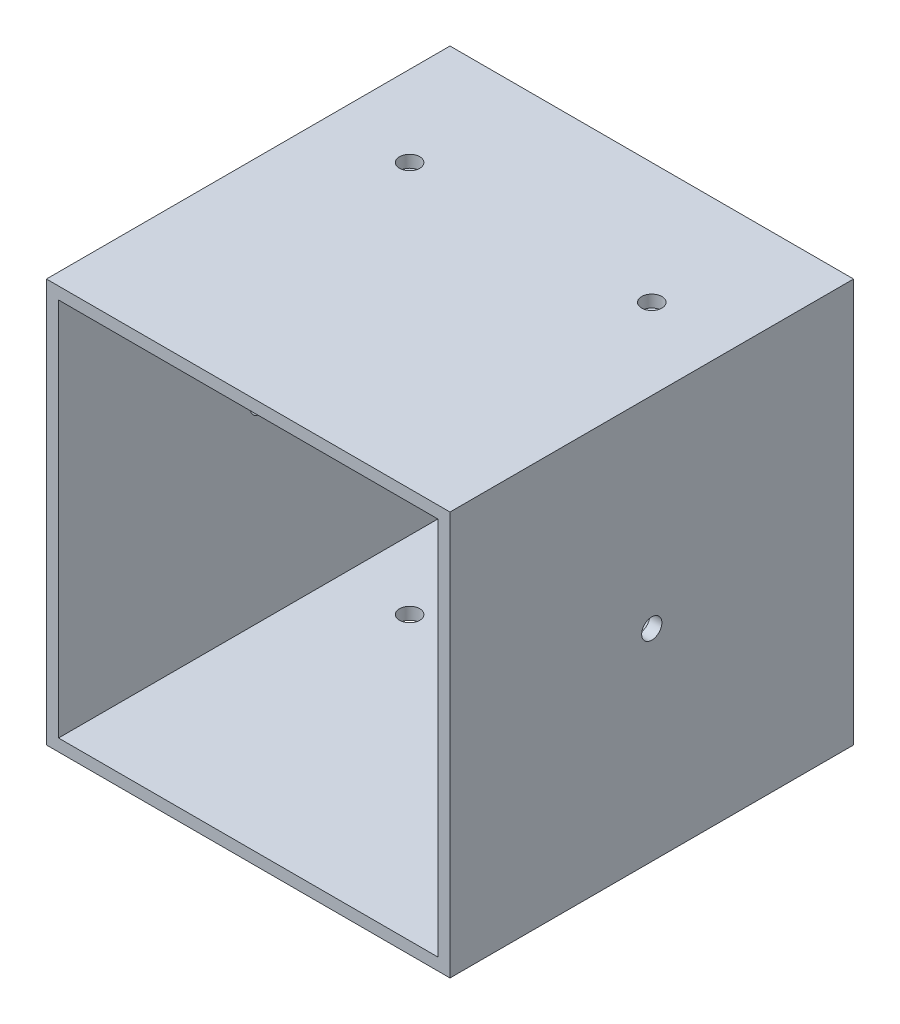
ISO-10303-21;
HEADER;
FILE_DESCRIPTION(('STEP AP214'),'2;1');
FILE_NAME('part.step','',(''),(''),'','','');
FILE_SCHEMA(('AUTOMOTIVE_DESIGN { 1 0 10303 214 1 1 1 1 }'));
ENDSEC;
DATA;
#1=APPLICATION_CONTEXT('core data for automotive mechanical design processes');
#2=APPLICATION_PROTOCOL_DEFINITION('international standard','automotive_design',2000,#1);
#3=PRODUCT_CONTEXT('',#1,'mechanical');
#4=PRODUCT('Part','Part','',(#3));
#5=PRODUCT_RELATED_PRODUCT_CATEGORY('part','',(#4));
#6=PRODUCT_DEFINITION_FORMATION('','',#4);
#7=PRODUCT_DEFINITION_CONTEXT('part definition',#1,'design');
#8=PRODUCT_DEFINITION('design','',#6,#7);
#9=PRODUCT_DEFINITION_SHAPE('','',#8);
#10=(LENGTH_UNIT() NAMED_UNIT(*) SI_UNIT(.MILLI.,.METRE.));
#11=(NAMED_UNIT(*) PLANE_ANGLE_UNIT() SI_UNIT($,.RADIAN.));
#12=(NAMED_UNIT(*) SI_UNIT($,.STERADIAN.) SOLID_ANGLE_UNIT());
#13=UNCERTAINTY_MEASURE_WITH_UNIT(LENGTH_MEASURE(1.E-05),#10,'distance_accuracy_value','');
#14=(GEOMETRIC_REPRESENTATION_CONTEXT(3) GLOBAL_UNCERTAINTY_ASSIGNED_CONTEXT((#13)) GLOBAL_UNIT_ASSIGNED_CONTEXT((#10,
#11,#12)) REPRESENTATION_CONTEXT('',''));
#15=CARTESIAN_POINT('',(0.,0.,0.));
#16=DIRECTION('',(0.,0.,1.));
#17=DIRECTION('',(1.,0.,0.));
#18=AXIS2_PLACEMENT_3D('',#15,#16,#17);
#19=CARTESIAN_POINT('',(-47.,-47.,50.));
#20=DIRECTION('',(1.,0.,0.));
#21=DIRECTION('',(0.,0.,-1.));
#22=AXIS2_PLACEMENT_3D('',#19,#20,#21);
#23=PLANE('',#22);
#24=CARTESIAN_POINT('',(-47.,0.,0.));
#25=DIRECTION('',(1.,0.,0.));
#26=DIRECTION('',(0.,0.,-1.));
#27=AXIS2_PLACEMENT_3D('',#24,#25,#26);
#28=CIRCLE('',#27,2.5);
#29=CARTESIAN_POINT('',(-47.,0.,-2.5));
#30=VERTEX_POINT('',#29);
#31=EDGE_CURVE('E145',#30,#30,#28,.T.);
#32=ORIENTED_EDGE('',*,*,#31,.F.);
#33=EDGE_LOOP('',(#32));
#34=FACE_BOUND('',#33,.T.);
#35=DIRECTION('',(0.,-1.,0.));
#36=VECTOR('',#35,1.);
#37=CARTESIAN_POINT('',(-47.,-47.,-50.));
#38=LINE('',#37,#36);
#39=CARTESIAN_POINT('',(-47.,47.,-50.));
#40=VERTEX_POINT('',#39);
#41=CARTESIAN_POINT('',(-47.,-47.,-50.));
#42=VERTEX_POINT('',#41);
#43=EDGE_CURVE('E159',#40,#42,#38,.T.);
#44=ORIENTED_EDGE('',*,*,#43,.F.);
#45=DIRECTION('',(0.,0.,-1.));
#46=VECTOR('',#45,1.);
#47=CARTESIAN_POINT('',(-47.,47.,50.));
#48=LINE('',#47,#46);
#49=CARTESIAN_POINT('',(-47.,47.,50.));
#50=VERTEX_POINT('',#49);
#51=EDGE_CURVE('E170',#50,#40,#48,.T.);
#52=ORIENTED_EDGE('',*,*,#51,.F.);
#53=DIRECTION('',(0.,-1.,0.));
#54=VECTOR('',#53,1.);
#55=CARTESIAN_POINT('',(-47.,-47.,50.));
#56=LINE('',#55,#54);
#57=CARTESIAN_POINT('',(-47.,-47.,50.));
#58=VERTEX_POINT('',#57);
#59=EDGE_CURVE('E160',#50,#58,#56,.T.);
#60=ORIENTED_EDGE('',*,*,#59,.T.);
#61=DIRECTION('',(0.,0.,-1.));
#62=VECTOR('',#61,1.);
#63=CARTESIAN_POINT('',(-47.,-47.,50.));
#64=LINE('',#63,#62);
#65=EDGE_CURVE('E187',#58,#42,#64,.T.);
#66=ORIENTED_EDGE('',*,*,#65,.T.);
#67=EDGE_LOOP('',(#44,#52,#60,#66));
#68=FACE_BOUND('',#67,.T.);
#69=DIRECTION('',(0.,1.,0.));
#70=VECTOR('',#69,1.);
#71=CARTESIAN_POINT('',(-47.,37.,-33.));
#72=LINE('',#71,#70);
#73=CARTESIAN_POINT('',(-47.,37.,-33.));
#74=VERTEX_POINT('',#73);
#75=CARTESIAN_POINT('',(-47.,40.,-33.));
#76=VERTEX_POINT('',#75);
#77=EDGE_CURVE('E49',#74,#76,#72,.T.);
#78=ORIENTED_EDGE('',*,*,#77,.F.);
#79=DIRECTION('',(0.,0.,-1.));
#80=VECTOR('',#79,1.);
#81=CARTESIAN_POINT('',(-47.,37.,33.));
#82=LINE('',#81,#80);
#83=CARTESIAN_POINT('',(-47.,37.,33.));
#84=VERTEX_POINT('',#83);
#85=EDGE_CURVE('E140',#84,#74,#82,.T.);
#86=ORIENTED_EDGE('',*,*,#85,.F.);
#87=DIRECTION('',(0.,-1.,0.));
#88=VECTOR('',#87,1.);
#89=CARTESIAN_POINT('',(-47.,40.,33.));
#90=LINE('',#89,#88);
#91=CARTESIAN_POINT('',(-47.,40.,33.));
#92=VERTEX_POINT('',#91);
#93=EDGE_CURVE('E126',#92,#84,#90,.T.);
#94=ORIENTED_EDGE('',*,*,#93,.F.);
#95=DIRECTION('',(0.,0.,1.));
#96=VECTOR('',#95,1.);
#97=CARTESIAN_POINT('',(-47.,40.,33.));
#98=LINE('',#97,#96);
#99=EDGE_CURVE('E135',#76,#92,#98,.T.);
#100=ORIENTED_EDGE('',*,*,#99,.F.);
#101=EDGE_LOOP('',(#78,#86,#94,#100));
#102=FACE_BOUND('',#101,.T.);
#103=ADVANCED_FACE('F32',(#34,#68,#102),#23,.T.);
#104=CARTESIAN_POINT('',(47.,-47.,50.));
#105=DIRECTION('',(-1.,0.,0.));
#106=DIRECTION('',(0.,0.,1.));
#107=AXIS2_PLACEMENT_3D('',#104,#105,#106);
#108=PLANE('',#107);
#109=CARTESIAN_POINT('',(47.,0.,0.));
#110=DIRECTION('',(-1.,0.,0.));
#111=DIRECTION('',(0.,0.,1.));
#112=AXIS2_PLACEMENT_3D('',#109,#110,#111);
#113=CIRCLE('',#112,2.5);
#114=CARTESIAN_POINT('',(47.,0.,2.5));
#115=VERTEX_POINT('',#114);
#116=EDGE_CURVE('E259',#115,#115,#113,.T.);
#117=ORIENTED_EDGE('',*,*,#116,.F.);
#118=EDGE_LOOP('',(#117));
#119=FACE_BOUND('',#118,.T.);
#120=DIRECTION('',(0.,1.,0.));
#121=VECTOR('',#120,1.);
#122=CARTESIAN_POINT('',(47.,-47.,-50.));
#123=LINE('',#122,#121);
#124=CARTESIAN_POINT('',(47.,-47.,-50.));
#125=VERTEX_POINT('',#124);
#126=CARTESIAN_POINT('',(47.,47.,-50.));
#127=VERTEX_POINT('',#126);
#128=EDGE_CURVE('E176',#125,#127,#123,.T.);
#129=ORIENTED_EDGE('',*,*,#128,.F.);
#130=DIRECTION('',(0.,0.,-1.));
#131=VECTOR('',#130,1.);
#132=CARTESIAN_POINT('',(47.,-47.,50.));
#133=LINE('',#132,#131);
#134=CARTESIAN_POINT('',(47.,-47.,50.));
#135=VERTEX_POINT('',#134);
#136=EDGE_CURVE('E185',#135,#125,#133,.T.);
#137=ORIENTED_EDGE('',*,*,#136,.F.);
#138=DIRECTION('',(0.,1.,0.));
#139=VECTOR('',#138,1.);
#140=CARTESIAN_POINT('',(47.,-47.,50.));
#141=LINE('',#140,#139);
#142=CARTESIAN_POINT('',(47.,47.,50.));
#143=VERTEX_POINT('',#142);
#144=EDGE_CURVE('E165',#135,#143,#141,.T.);
#145=ORIENTED_EDGE('',*,*,#144,.T.);
#146=DIRECTION('',(0.,0.,-1.));
#147=VECTOR('',#146,1.);
#148=CARTESIAN_POINT('',(47.,47.,50.));
#149=LINE('',#148,#147);
#150=EDGE_CURVE('E183',#143,#127,#149,.T.);
#151=ORIENTED_EDGE('',*,*,#150,.T.);
#152=EDGE_LOOP('',(#129,#137,#145,#151));
#153=FACE_BOUND('',#152,.T.);
#154=DIRECTION('',(0.,1.,0.));
#155=VECTOR('',#154,1.);
#156=CARTESIAN_POINT('',(47.,40.,33.));
#157=LINE('',#156,#155);
#158=CARTESIAN_POINT('',(47.,37.,33.));
#159=VERTEX_POINT('',#158);
#160=CARTESIAN_POINT('',(47.,40.,33.));
#161=VERTEX_POINT('',#160);
#162=EDGE_CURVE('E129',#159,#161,#157,.T.);
#163=ORIENTED_EDGE('',*,*,#162,.F.);
#164=DIRECTION('',(0.,0.,1.));
#165=VECTOR('',#164,1.);
#166=CARTESIAN_POINT('',(47.,37.,33.));
#167=LINE('',#166,#165);
#168=CARTESIAN_POINT('',(47.,37.,-33.));
#169=VERTEX_POINT('',#168);
#170=EDGE_CURVE('E151',#169,#159,#167,.T.);
#171=ORIENTED_EDGE('',*,*,#170,.F.);
#172=DIRECTION('',(0.,-1.,0.));
#173=VECTOR('',#172,1.);
#174=CARTESIAN_POINT('',(47.,37.,-33.));
#175=LINE('',#174,#173);
#176=CARTESIAN_POINT('',(47.,40.,-33.));
#177=VERTEX_POINT('',#176);
#178=EDGE_CURVE('E157',#177,#169,#175,.T.);
#179=ORIENTED_EDGE('',*,*,#178,.F.);
#180=DIRECTION('',(0.,0.,-1.));
#181=VECTOR('',#180,1.);
#182=CARTESIAN_POINT('',(47.,40.,33.));
#183=LINE('',#182,#181);
#184=EDGE_CURVE('E155',#161,#177,#183,.T.);
#185=ORIENTED_EDGE('',*,*,#184,.F.);
#186=EDGE_LOOP('',(#163,#171,#179,#185));
#187=FACE_BOUND('',#186,.T.);
#188=ADVANCED_FACE('F272',(#119,#153,#187),#108,.T.);
#189=CARTESIAN_POINT('',(0.,0.,50.));
#190=DIRECTION('',(0.,0.,-1.));
#191=DIRECTION('',(-1.,0.,0.));
#192=AXIS2_PLACEMENT_3D('',#189,#190,#191);
#193=PLANE('',#192);
#194=DIRECTION('',(0.,1.,0.));
#195=VECTOR('',#194,1.);
#196=CARTESIAN_POINT('',(50.,-50.,50.));
#197=LINE('',#196,#195);
#198=CARTESIAN_POINT('',(50.,-50.,50.));
#199=VERTEX_POINT('',#198);
#200=CARTESIAN_POINT('',(50.,50.,50.));
#201=VERTEX_POINT('',#200);
#202=EDGE_CURVE('E191',#199,#201,#197,.T.);
#203=ORIENTED_EDGE('',*,*,#202,.T.);
#204=DIRECTION('',(-1.,0.,0.));
#205=VECTOR('',#204,1.);
#206=CARTESIAN_POINT('',(-50.,50.,50.));
#207=LINE('',#206,#205);
#208=CARTESIAN_POINT('',(-50.,50.,50.));
#209=VERTEX_POINT('',#208);
#210=EDGE_CURVE('E194',#201,#209,#207,.T.);
#211=ORIENTED_EDGE('',*,*,#210,.T.);
#212=DIRECTION('',(0.,-1.,0.));
#213=VECTOR('',#212,1.);
#214=CARTESIAN_POINT('',(-50.,-50.,50.));
#215=LINE('',#214,#213);
#216=CARTESIAN_POINT('',(-50.,-50.,50.));
#217=VERTEX_POINT('',#216);
#218=EDGE_CURVE('E197',#209,#217,#215,.T.);
#219=ORIENTED_EDGE('',*,*,#218,.T.);
#220=DIRECTION('',(1.,0.,0.));
#221=VECTOR('',#220,1.);
#222=CARTESIAN_POINT('',(-50.,-50.,50.));
#223=LINE('',#222,#221);
#224=EDGE_CURVE('E199',#217,#199,#223,.T.);
#225=ORIENTED_EDGE('',*,*,#224,.T.);
#226=EDGE_LOOP('',(#203,#211,#219,#225));
#227=FACE_BOUND('',#226,.T.);
#228=ORIENTED_EDGE('',*,*,#59,.F.);
#229=DIRECTION('',(-1.,0.,0.));
#230=VECTOR('',#229,1.);
#231=CARTESIAN_POINT('',(-47.,47.,50.));
#232=LINE('',#231,#230);
#233=EDGE_CURVE('E168',#143,#50,#232,.T.);
#234=ORIENTED_EDGE('',*,*,#233,.F.);
#235=ORIENTED_EDGE('',*,*,#144,.F.);
#236=DIRECTION('',(1.,0.,0.));
#237=VECTOR('',#236,1.);
#238=CARTESIAN_POINT('',(-47.,-47.,50.));
#239=LINE('',#238,#237);
#240=EDGE_CURVE('E162',#58,#135,#239,.T.);
#241=ORIENTED_EDGE('',*,*,#240,.F.);
#242=EDGE_LOOP('',(#228,#234,#235,#241));
#243=FACE_BOUND('',#242,.T.);
#244=ADVANCED_FACE('F290',(#227,#243),#193,.F.);
#245=CARTESIAN_POINT('',(0.,0.,-50.));
#246=DIRECTION('',(0.,0.,-1.));
#247=DIRECTION('',(-1.,0.,0.));
#248=AXIS2_PLACEMENT_3D('',#245,#246,#247);
#249=PLANE('',#248);
#250=DIRECTION('',(0.,1.,0.));
#251=VECTOR('',#250,1.);
#252=CARTESIAN_POINT('',(50.,-50.,-50.));
#253=LINE('',#252,#251);
#254=CARTESIAN_POINT('',(50.,-50.,-50.));
#255=VERTEX_POINT('',#254);
#256=CARTESIAN_POINT('',(50.,50.,-50.));
#257=VERTEX_POINT('',#256);
#258=EDGE_CURVE('E190',#255,#257,#253,.T.);
#259=ORIENTED_EDGE('',*,*,#258,.F.);
#260=DIRECTION('',(1.,0.,0.));
#261=VECTOR('',#260,1.);
#262=CARTESIAN_POINT('',(-50.,-50.,-50.));
#263=LINE('',#262,#261);
#264=CARTESIAN_POINT('',(-50.,-50.,-50.));
#265=VERTEX_POINT('',#264);
#266=EDGE_CURVE('E195',#265,#255,#263,.T.);
#267=ORIENTED_EDGE('',*,*,#266,.F.);
#268=DIRECTION('',(0.,-1.,0.));
#269=VECTOR('',#268,1.);
#270=CARTESIAN_POINT('',(-50.,-50.,-50.));
#271=LINE('',#270,#269);
#272=CARTESIAN_POINT('',(-50.,50.,-50.));
#273=VERTEX_POINT('',#272);
#274=EDGE_CURVE('E206',#273,#265,#271,.T.);
#275=ORIENTED_EDGE('',*,*,#274,.F.);
#276=DIRECTION('',(-1.,0.,0.));
#277=VECTOR('',#276,1.);
#278=CARTESIAN_POINT('',(-50.,50.,-50.));
#279=LINE('',#278,#277);
#280=EDGE_CURVE('E204',#257,#273,#279,.T.);
#281=ORIENTED_EDGE('',*,*,#280,.F.);
#282=EDGE_LOOP('',(#259,#267,#275,#281));
#283=FACE_BOUND('',#282,.T.);
#284=DIRECTION('',(-1.,0.,0.));
#285=VECTOR('',#284,1.);
#286=CARTESIAN_POINT('',(-47.,47.,-50.));
#287=LINE('',#286,#285);
#288=EDGE_CURVE('E163',#127,#40,#287,.T.);
#289=ORIENTED_EDGE('',*,*,#288,.T.);
#290=ORIENTED_EDGE('',*,*,#43,.T.);
#291=DIRECTION('',(1.,0.,0.));
#292=VECTOR('',#291,1.);
#293=CARTESIAN_POINT('',(-47.,-47.,-50.));
#294=LINE('',#293,#292);
#295=EDGE_CURVE('E173',#42,#125,#294,.T.);
#296=ORIENTED_EDGE('',*,*,#295,.T.);
#297=ORIENTED_EDGE('',*,*,#128,.T.);
#298=EDGE_LOOP('',(#289,#290,#296,#297));
#299=FACE_BOUND('',#298,.T.);
#300=ADVANCED_FACE('F282',(#283,#299),#249,.T.);
#301=CARTESIAN_POINT('',(50.,-50.,50.));
#302=DIRECTION('',(-1.,0.,0.));
#303=DIRECTION('',(0.,0.,1.));
#304=AXIS2_PLACEMENT_3D('',#301,#302,#303);
#305=PLANE('',#304);
#306=CARTESIAN_POINT('',(50.,0.,0.));
#307=DIRECTION('',(1.,0.,0.));
#308=DIRECTION('',(0.,0.,-1.));
#309=AXIS2_PLACEMENT_3D('',#306,#307,#308);
#310=CIRCLE('',#309,2.5);
#311=CARTESIAN_POINT('',(50.,0.,-2.5));
#312=VERTEX_POINT('',#311);
#313=EDGE_CURVE('E255',#312,#312,#310,.T.);
#314=ORIENTED_EDGE('',*,*,#313,.F.);
#315=EDGE_LOOP('',(#314));
#316=FACE_BOUND('',#315,.T.);
#317=ORIENTED_EDGE('',*,*,#258,.T.);
#318=DIRECTION('',(0.,0.,-1.));
#319=VECTOR('',#318,1.);
#320=CARTESIAN_POINT('',(50.,50.,50.));
#321=LINE('',#320,#319);
#322=EDGE_CURVE('E11',#201,#257,#321,.T.);
#323=ORIENTED_EDGE('',*,*,#322,.F.);
#324=ORIENTED_EDGE('',*,*,#202,.F.);
#325=DIRECTION('',(0.,0.,-1.));
#326=VECTOR('',#325,1.);
#327=CARTESIAN_POINT('',(50.,-50.,50.));
#328=LINE('',#327,#326);
#329=EDGE_CURVE('E201',#199,#255,#328,.T.);
#330=ORIENTED_EDGE('',*,*,#329,.T.);
#331=EDGE_LOOP('',(#317,#323,#324,#330));
#332=FACE_BOUND('',#331,.T.);
#333=ADVANCED_FACE('F34',(#316,#332),#305,.F.);
#334=CARTESIAN_POINT('',(-50.,50.,50.));
#335=DIRECTION('',(0.,-1.,0.));
#336=DIRECTION('',(0.,0.,-1.));
#337=AXIS2_PLACEMENT_3D('',#334,#335,#336);
#338=PLANE('',#337);
#339=CARTESIAN_POINT('',(-30.,50.,-20.));
#340=DIRECTION('',(0.,1.,0.));
#341=DIRECTION('',(0.,0.,1.));
#342=AXIS2_PLACEMENT_3D('',#339,#340,#341);
#343=CIRCLE('',#342,2.5);
#344=CARTESIAN_POINT('',(-30.,50.,-17.5));
#345=VERTEX_POINT('',#344);
#346=EDGE_CURVE('E225',#345,#345,#343,.T.);
#347=ORIENTED_EDGE('',*,*,#346,.F.);
#348=EDGE_LOOP('',(#347));
#349=FACE_BOUND('',#348,.T.);
#350=CARTESIAN_POINT('',(30.,50.,-20.));
#351=DIRECTION('',(0.,1.,0.));
#352=DIRECTION('',(0.,0.,1.));
#353=AXIS2_PLACEMENT_3D('',#350,#351,#352);
#354=CIRCLE('',#353,2.5);
#355=CARTESIAN_POINT('',(30.,50.,-17.5));
#356=VERTEX_POINT('',#355);
#357=EDGE_CURVE('E238',#356,#356,#354,.T.);
#358=ORIENTED_EDGE('',*,*,#357,.F.);
#359=EDGE_LOOP('',(#358));
#360=FACE_BOUND('',#359,.T.);
#361=ORIENTED_EDGE('',*,*,#280,.T.);
#362=DIRECTION('',(0.,0.,-1.));
#363=VECTOR('',#362,1.);
#364=CARTESIAN_POINT('',(-50.,50.,50.));
#365=LINE('',#364,#363);
#366=EDGE_CURVE('E41',#209,#273,#365,.T.);
#367=ORIENTED_EDGE('',*,*,#366,.F.);
#368=ORIENTED_EDGE('',*,*,#210,.F.);
#369=ORIENTED_EDGE('',*,*,#322,.T.);
#370=EDGE_LOOP('',(#361,#367,#368,#369));
#371=FACE_BOUND('',#370,.T.);
#372=ADVANCED_FACE('F317',(#349,#360,#371),#338,.F.);
#373=CARTESIAN_POINT('',(-50.,-50.,50.));
#374=DIRECTION('',(1.,0.,0.));
#375=DIRECTION('',(0.,0.,-1.));
#376=AXIS2_PLACEMENT_3D('',#373,#374,#375);
#377=PLANE('',#376);
#378=CARTESIAN_POINT('',(-50.,0.,0.));
#379=DIRECTION('',(1.,0.,0.));
#380=DIRECTION('',(0.,0.,-1.));
#381=AXIS2_PLACEMENT_3D('',#378,#379,#380);
#382=CIRCLE('',#381,2.5);
#383=CARTESIAN_POINT('',(-50.,0.,-2.5));
#384=VERTEX_POINT('',#383);
#385=EDGE_CURVE('E256',#384,#384,#382,.T.);
#386=ORIENTED_EDGE('',*,*,#385,.T.);
#387=EDGE_LOOP('',(#386));
#388=FACE_BOUND('',#387,.T.);
#389=ORIENTED_EDGE('',*,*,#274,.T.);
#390=DIRECTION('',(0.,0.,-1.));
#391=VECTOR('',#390,1.);
#392=CARTESIAN_POINT('',(-50.,-50.,50.));
#393=LINE('',#392,#391);
#394=EDGE_CURVE('E211',#217,#265,#393,.T.);
#395=ORIENTED_EDGE('',*,*,#394,.F.);
#396=ORIENTED_EDGE('',*,*,#218,.F.);
#397=ORIENTED_EDGE('',*,*,#366,.T.);
#398=EDGE_LOOP('',(#389,#395,#396,#397));
#399=FACE_BOUND('',#398,.T.);
#400=ADVANCED_FACE('F304',(#388,#399),#377,.F.);
#401=CARTESIAN_POINT('',(-50.,-50.,50.));
#402=DIRECTION('',(0.,1.,0.));
#403=DIRECTION('',(0.,0.,1.));
#404=AXIS2_PLACEMENT_3D('',#401,#402,#403);
#405=PLANE('',#404);
#406=CARTESIAN_POINT('',(-30.,-50.,-20.));
#407=DIRECTION('',(0.,1.,0.));
#408=DIRECTION('',(0.,0.,1.));
#409=AXIS2_PLACEMENT_3D('',#406,#407,#408);
#410=CIRCLE('',#409,2.5);
#411=CARTESIAN_POINT('',(-30.,-50.,-17.5));
#412=VERTEX_POINT('',#411);
#413=EDGE_CURVE('E218',#412,#412,#410,.T.);
#414=ORIENTED_EDGE('',*,*,#413,.T.);
#415=EDGE_LOOP('',(#414));
#416=FACE_BOUND('',#415,.T.);
#417=CARTESIAN_POINT('',(30.,-50.,-20.));
#418=DIRECTION('',(0.,1.,0.));
#419=DIRECTION('',(0.,0.,1.));
#420=AXIS2_PLACEMENT_3D('',#417,#418,#419);
#421=CIRCLE('',#420,2.5);
#422=CARTESIAN_POINT('',(30.,-50.,-17.5));
#423=VERTEX_POINT('',#422);
#424=EDGE_CURVE('E230',#423,#423,#421,.T.);
#425=ORIENTED_EDGE('',*,*,#424,.T.);
#426=EDGE_LOOP('',(#425));
#427=FACE_BOUND('',#426,.T.);
#428=ORIENTED_EDGE('',*,*,#266,.T.);
#429=ORIENTED_EDGE('',*,*,#329,.F.);
#430=ORIENTED_EDGE('',*,*,#224,.F.);
#431=ORIENTED_EDGE('',*,*,#394,.T.);
#432=EDGE_LOOP('',(#428,#429,#430,#431));
#433=FACE_BOUND('',#432,.T.);
#434=ADVANCED_FACE('F294',(#416,#427,#433),#405,.F.);
#435=CARTESIAN_POINT('',(-47.,-47.,50.));
#436=DIRECTION('',(0.,1.,0.));
#437=DIRECTION('',(0.,0.,1.));
#438=AXIS2_PLACEMENT_3D('',#435,#436,#437);
#439=PLANE('',#438);
#440=CARTESIAN_POINT('',(-30.,-47.,-20.));
#441=DIRECTION('',(0.,1.,0.));
#442=DIRECTION('',(0.,0.,1.));
#443=AXIS2_PLACEMENT_3D('',#440,#441,#442);
#444=CIRCLE('',#443,2.5);
#445=CARTESIAN_POINT('',(-30.,-47.,-17.5));
#446=VERTEX_POINT('',#445);
#447=EDGE_CURVE('E252',#446,#446,#444,.T.);
#448=ORIENTED_EDGE('',*,*,#447,.F.);
#449=EDGE_LOOP('',(#448));
#450=FACE_BOUND('',#449,.T.);
#451=CARTESIAN_POINT('',(30.,-47.,-20.));
#452=DIRECTION('',(0.,1.,0.));
#453=DIRECTION('',(0.,0.,1.));
#454=AXIS2_PLACEMENT_3D('',#451,#452,#453);
#455=CIRCLE('',#454,2.5);
#456=CARTESIAN_POINT('',(30.,-47.,-17.5));
#457=VERTEX_POINT('',#456);
#458=EDGE_CURVE('E243',#457,#457,#455,.T.);
#459=ORIENTED_EDGE('',*,*,#458,.F.);
#460=EDGE_LOOP('',(#459));
#461=FACE_BOUND('',#460,.T.);
#462=ORIENTED_EDGE('',*,*,#295,.F.);
#463=ORIENTED_EDGE('',*,*,#65,.F.);
#464=ORIENTED_EDGE('',*,*,#240,.T.);
#465=ORIENTED_EDGE('',*,*,#136,.T.);
#466=EDGE_LOOP('',(#462,#463,#464,#465));
#467=FACE_BOUND('',#466,.T.);
#468=ADVANCED_FACE('F292',(#450,#461,#467),#439,.T.);
#469=CARTESIAN_POINT('',(-47.,47.,50.));
#470=DIRECTION('',(0.,-1.,0.));
#471=DIRECTION('',(1.,0.,0.));
#472=AXIS2_PLACEMENT_3D('',#469,#470,#471);
#473=PLANE('',#472);
#474=CARTESIAN_POINT('',(-30.,47.,-20.));
#475=DIRECTION('',(0.,-1.,0.));
#476=DIRECTION('',(1.,0.,0.));
#477=AXIS2_PLACEMENT_3D('',#474,#475,#476);
#478=CIRCLE('',#477,2.5);
#479=CARTESIAN_POINT('',(-27.5,47.,-20.));
#480=VERTEX_POINT('',#479);
#481=EDGE_CURVE('E249',#480,#480,#478,.T.);
#482=ORIENTED_EDGE('',*,*,#481,.F.);
#483=EDGE_LOOP('',(#482));
#484=FACE_BOUND('',#483,.T.);
#485=CARTESIAN_POINT('',(30.,47.,-20.));
#486=DIRECTION('',(0.,-1.,0.));
#487=DIRECTION('',(1.,0.,0.));
#488=AXIS2_PLACEMENT_3D('',#485,#486,#487);
#489=CIRCLE('',#488,2.5);
#490=CARTESIAN_POINT('',(32.5,47.,-20.));
#491=VERTEX_POINT('',#490);
#492=EDGE_CURVE('E222',#491,#491,#489,.T.);
#493=ORIENTED_EDGE('',*,*,#492,.F.);
#494=EDGE_LOOP('',(#493));
#495=FACE_BOUND('',#494,.T.);
#496=ORIENTED_EDGE('',*,*,#288,.F.);
#497=ORIENTED_EDGE('',*,*,#150,.F.);
#498=ORIENTED_EDGE('',*,*,#233,.T.);
#499=ORIENTED_EDGE('',*,*,#51,.T.);
#500=EDGE_LOOP('',(#496,#497,#498,#499));
#501=FACE_BOUND('',#500,.T.);
#502=ADVANCED_FACE('F280',(#484,#495,#501),#473,.T.);
#503=CARTESIAN_POINT('',(50.002,37.,33.));
#504=DIRECTION('',(0.,1.,0.));
#505=DIRECTION('',(0.,0.,1.));
#506=AXIS2_PLACEMENT_3D('',#503,#504,#505);
#507=PLANE('',#506);
#508=CARTESIAN_POINT('',(-30.,37.,0.));
#509=DIRECTION('',(0.,1.,0.));
#510=DIRECTION('',(0.,0.,1.));
#511=AXIS2_PLACEMENT_3D('',#508,#509,#510);
#512=CIRCLE('',#511,2.5);
#513=CARTESIAN_POINT('',(-30.,37.,2.5));
#514=VERTEX_POINT('',#513);
#515=EDGE_CURVE('E233',#514,#514,#512,.T.);
#516=ORIENTED_EDGE('',*,*,#515,.T.);
#517=EDGE_LOOP('',(#516));
#518=FACE_BOUND('',#517,.T.);
#519=CARTESIAN_POINT('',(30.,37.,0.));
#520=DIRECTION('',(0.,1.,0.));
#521=DIRECTION('',(0.,0.,1.));
#522=AXIS2_PLACEMENT_3D('',#519,#520,#521);
#523=CIRCLE('',#522,2.5);
#524=CARTESIAN_POINT('',(30.,37.,2.5));
#525=VERTEX_POINT('',#524);
#526=EDGE_CURVE('E393',#525,#525,#523,.T.);
#527=ORIENTED_EDGE('',*,*,#526,.T.);
#528=EDGE_LOOP('',(#527));
#529=FACE_BOUND('',#528,.T.);
#530=CARTESIAN_POINT('',(-30.,37.,-20.));
#531=DIRECTION('',(0.,1.,0.));
#532=DIRECTION('',(0.,0.,1.));
#533=AXIS2_PLACEMENT_3D('',#530,#531,#532);
#534=CIRCLE('',#533,2.5);
#535=CARTESIAN_POINT('',(-30.,37.,-17.5));
#536=VERTEX_POINT('',#535);
#537=EDGE_CURVE('E246',#536,#536,#534,.T.);
#538=ORIENTED_EDGE('',*,*,#537,.T.);
#539=EDGE_LOOP('',(#538));
#540=FACE_BOUND('',#539,.T.);
#541=CARTESIAN_POINT('',(30.,37.,-20.));
#542=DIRECTION('',(0.,1.,0.));
#543=DIRECTION('',(0.,0.,1.));
#544=AXIS2_PLACEMENT_3D('',#541,#542,#543);
#545=CIRCLE('',#544,2.5);
#546=CARTESIAN_POINT('',(30.,37.,-17.5));
#547=VERTEX_POINT('',#546);
#548=EDGE_CURVE('E217',#547,#547,#545,.T.);
#549=ORIENTED_EDGE('',*,*,#548,.T.);
#550=EDGE_LOOP('',(#549));
#551=FACE_BOUND('',#550,.T.);
#552=DIRECTION('',(-1.,0.,0.));
#553=VECTOR('',#552,1.);
#554=CARTESIAN_POINT('',(50.002,37.,-33.));
#555=LINE('',#554,#553);
#556=EDGE_CURVE('E142',#169,#74,#555,.T.);
#557=ORIENTED_EDGE('',*,*,#556,.F.);
#558=ORIENTED_EDGE('',*,*,#170,.T.);
#559=DIRECTION('',(-1.,0.,0.));
#560=VECTOR('',#559,1.);
#561=CARTESIAN_POINT('',(50.002,37.,33.));
#562=LINE('',#561,#560);
#563=EDGE_CURVE('E132',#159,#84,#562,.T.);
#564=ORIENTED_EDGE('',*,*,#563,.T.);
#565=ORIENTED_EDGE('',*,*,#85,.T.);
#566=EDGE_LOOP('',(#557,#558,#564,#565));
#567=FACE_BOUND('',#566,.T.);
#568=ADVANCED_FACE('F301',(#518,#529,#540,#551,#567),#507,.F.);
#569=CARTESIAN_POINT('',(50.002,37.,-33.));
#570=DIRECTION('',(0.,0.,1.));
#571=DIRECTION('',(1.,0.,0.));
#572=AXIS2_PLACEMENT_3D('',#569,#570,#571);
#573=PLANE('',#572);
#574=DIRECTION('',(-1.,0.,0.));
#575=VECTOR('',#574,1.);
#576=CARTESIAN_POINT('',(50.002,40.,-33.));
#577=LINE('',#576,#575);
#578=EDGE_CURVE('E131',#177,#76,#577,.T.);
#579=ORIENTED_EDGE('',*,*,#578,.F.);
#580=ORIENTED_EDGE('',*,*,#178,.T.);
#581=ORIENTED_EDGE('',*,*,#556,.T.);
#582=ORIENTED_EDGE('',*,*,#77,.T.);
#583=EDGE_LOOP('',(#579,#580,#581,#582));
#584=FACE_BOUND('',#583,.T.);
#585=ADVANCED_FACE('F415',(#584),#573,.F.);
#586=CARTESIAN_POINT('',(50.002,40.,33.));
#587=DIRECTION('',(0.,0.,-1.));
#588=DIRECTION('',(-1.,0.,0.));
#589=AXIS2_PLACEMENT_3D('',#586,#587,#588);
#590=PLANE('',#589);
#591=ORIENTED_EDGE('',*,*,#563,.F.);
#592=ORIENTED_EDGE('',*,*,#162,.T.);
#593=DIRECTION('',(-1.,0.,0.));
#594=VECTOR('',#593,1.);
#595=CARTESIAN_POINT('',(50.002,40.,33.));
#596=LINE('',#595,#594);
#597=EDGE_CURVE('E57',#161,#92,#596,.T.);
#598=ORIENTED_EDGE('',*,*,#597,.T.);
#599=ORIENTED_EDGE('',*,*,#93,.T.);
#600=EDGE_LOOP('',(#591,#592,#598,#599));
#601=FACE_BOUND('',#600,.T.);
#602=ADVANCED_FACE('F124',(#601),#590,.F.);
#603=CARTESIAN_POINT('',(50.002,40.,33.));
#604=DIRECTION('',(0.,-1.,0.));
#605=DIRECTION('',(0.,0.,-1.));
#606=AXIS2_PLACEMENT_3D('',#603,#604,#605);
#607=PLANE('',#606);
#608=CARTESIAN_POINT('',(-30.,40.,0.));
#609=DIRECTION('',(0.,1.,0.));
#610=DIRECTION('',(0.,0.,1.));
#611=AXIS2_PLACEMENT_3D('',#608,#609,#610);
#612=CIRCLE('',#611,2.5);
#613=CARTESIAN_POINT('',(-30.,40.,2.5));
#614=VERTEX_POINT('',#613);
#615=EDGE_CURVE('E389',#614,#614,#612,.T.);
#616=ORIENTED_EDGE('',*,*,#615,.F.);
#617=EDGE_LOOP('',(#616));
#618=FACE_BOUND('',#617,.T.);
#619=CARTESIAN_POINT('',(30.,40.,0.));
#620=DIRECTION('',(0.,1.,0.));
#621=DIRECTION('',(0.,0.,1.));
#622=AXIS2_PLACEMENT_3D('',#619,#620,#621);
#623=CIRCLE('',#622,2.5);
#624=CARTESIAN_POINT('',(30.,40.,2.5));
#625=VERTEX_POINT('',#624);
#626=EDGE_CURVE('E397',#625,#625,#623,.T.);
#627=ORIENTED_EDGE('',*,*,#626,.F.);
#628=EDGE_LOOP('',(#627));
#629=FACE_BOUND('',#628,.T.);
#630=CARTESIAN_POINT('',(-30.,40.,-20.));
#631=DIRECTION('',(0.,-1.,0.));
#632=DIRECTION('',(0.,0.,-1.));
#633=AXIS2_PLACEMENT_3D('',#630,#631,#632);
#634=CIRCLE('',#633,2.5);
#635=CARTESIAN_POINT('',(-30.,40.,-17.5));
#636=VERTEX_POINT('',#635);
#637=EDGE_CURVE('E36',#636,#636,#634,.T.);
#638=ORIENTED_EDGE('',*,*,#637,.T.);
#639=EDGE_LOOP('',(#638));
#640=FACE_BOUND('',#639,.T.);
#641=CARTESIAN_POINT('',(30.,40.,-20.));
#642=DIRECTION('',(0.,-1.,0.));
#643=DIRECTION('',(0.,0.,-1.));
#644=AXIS2_PLACEMENT_3D('',#641,#642,#643);
#645=CIRCLE('',#644,2.5);
#646=CARTESIAN_POINT('',(30.,40.,-17.5));
#647=VERTEX_POINT('',#646);
#648=EDGE_CURVE('E215',#647,#647,#645,.T.);
#649=ORIENTED_EDGE('',*,*,#648,.T.);
#650=EDGE_LOOP('',(#649));
#651=FACE_BOUND('',#650,.T.);
#652=ORIENTED_EDGE('',*,*,#597,.F.);
#653=ORIENTED_EDGE('',*,*,#184,.T.);
#654=ORIENTED_EDGE('',*,*,#578,.T.);
#655=ORIENTED_EDGE('',*,*,#99,.T.);
#656=EDGE_LOOP('',(#652,#653,#654,#655));
#657=FACE_BOUND('',#656,.T.);
#658=ADVANCED_FACE('F136',(#618,#629,#640,#651,#657),#607,.F.);
#659=CARTESIAN_POINT('',(-50.,0.,0.));
#660=DIRECTION('',(1.,0.,0.));
#661=DIRECTION('',(0.,0.,-1.));
#662=AXIS2_PLACEMENT_3D('',#659,#660,#661);
#663=CYLINDRICAL_SURFACE('',#662,2.5);
#664=ORIENTED_EDGE('',*,*,#31,.T.);
#665=EDGE_LOOP('',(#664));
#666=FACE_BOUND('',#665,.T.);
#667=ORIENTED_EDGE('',*,*,#385,.F.);
#668=EDGE_LOOP('',(#667));
#669=FACE_BOUND('',#668,.T.);
#670=ADVANCED_FACE('F267',(#666,#669),#663,.F.);
#671=ORIENTED_EDGE('',*,*,#116,.T.);
#672=EDGE_LOOP('',(#671));
#673=FACE_BOUND('',#672,.T.);
#674=ORIENTED_EDGE('',*,*,#313,.T.);
#675=EDGE_LOOP('',(#674));
#676=FACE_BOUND('',#675,.T.);
#677=ADVANCED_FACE('F361',(#673,#676),#663,.F.);
#678=CARTESIAN_POINT('',(30.,-50.,-20.));
#679=DIRECTION('',(0.,1.,0.));
#680=DIRECTION('',(0.,0.,1.));
#681=AXIS2_PLACEMENT_3D('',#678,#679,#680);
#682=CYLINDRICAL_SURFACE('',#681,2.5);
#683=CARTESIAN_POINT('',(30.,40.,-17.5));
#684=CARTESIAN_POINT('',(30.,39.96875,-17.5));
#685=CARTESIAN_POINT('',(30.,39.9375,-17.5));
#686=CARTESIAN_POINT('',(30.,39.875,-17.5));
#687=CARTESIAN_POINT('',(30.,39.84375,-17.5));
#688=CARTESIAN_POINT('',(30.,39.78125,-17.5));
#689=CARTESIAN_POINT('',(30.,39.75,-17.5));
#690=CARTESIAN_POINT('',(30.,39.6875,-17.5));
#691=CARTESIAN_POINT('',(30.,39.65625,-17.5));
#692=CARTESIAN_POINT('',(30.,39.59375,-17.5));
#693=CARTESIAN_POINT('',(30.,39.5625,-17.5));
#694=CARTESIAN_POINT('',(30.,39.5,-17.5));
#695=CARTESIAN_POINT('',(30.,39.46875,-17.5));
#696=CARTESIAN_POINT('',(30.,39.40625,-17.5));
#697=CARTESIAN_POINT('',(30.,39.375,-17.5));
#698=CARTESIAN_POINT('',(30.,39.3125,-17.5));
#699=CARTESIAN_POINT('',(30.,39.28125,-17.5));
#700=CARTESIAN_POINT('',(30.,39.21875,-17.5));
#701=CARTESIAN_POINT('',(30.,39.1875,-17.5));
#702=CARTESIAN_POINT('',(30.,39.125,-17.5));
#703=CARTESIAN_POINT('',(30.,39.09375,-17.5));
#704=CARTESIAN_POINT('',(30.,39.03125,-17.5));
#705=CARTESIAN_POINT('',(30.,39.,-17.5));
#706=CARTESIAN_POINT('',(30.,38.9375,-17.5));
#707=CARTESIAN_POINT('',(30.,38.90625,-17.5));
#708=CARTESIAN_POINT('',(30.,38.84375,-17.5));
#709=CARTESIAN_POINT('',(30.,38.8125,-17.5));
#710=CARTESIAN_POINT('',(30.,38.75,-17.5));
#711=CARTESIAN_POINT('',(30.,38.71875,-17.5));
#712=CARTESIAN_POINT('',(30.,38.65625,-17.5));
#713=CARTESIAN_POINT('',(30.,38.625,-17.5));
#714=CARTESIAN_POINT('',(30.,38.5625,-17.5));
#715=CARTESIAN_POINT('',(30.,38.53125,-17.5));
#716=CARTESIAN_POINT('',(30.,38.46875,-17.5));
#717=CARTESIAN_POINT('',(30.,38.4375,-17.5));
#718=CARTESIAN_POINT('',(30.,38.375,-17.5));
#719=CARTESIAN_POINT('',(30.,38.34375,-17.5));
#720=CARTESIAN_POINT('',(30.,38.28125,-17.5));
#721=CARTESIAN_POINT('',(30.,38.25,-17.5));
#722=CARTESIAN_POINT('',(30.,38.1875,-17.5));
#723=CARTESIAN_POINT('',(30.,38.15625,-17.5));
#724=CARTESIAN_POINT('',(30.,38.09375,-17.5));
#725=CARTESIAN_POINT('',(30.,38.0625,-17.5));
#726=CARTESIAN_POINT('',(30.,38.,-17.5));
#727=CARTESIAN_POINT('',(30.,37.96875,-17.5));
#728=CARTESIAN_POINT('',(30.,37.90625,-17.5));
#729=CARTESIAN_POINT('',(30.,37.875,-17.5));
#730=CARTESIAN_POINT('',(30.,37.8125,-17.5));
#731=CARTESIAN_POINT('',(30.,37.78125,-17.5));
#732=CARTESIAN_POINT('',(30.,37.71875,-17.5));
#733=CARTESIAN_POINT('',(30.,37.6875,-17.5));
#734=CARTESIAN_POINT('',(30.,37.625,-17.5));
#735=CARTESIAN_POINT('',(30.,37.59375,-17.5));
#736=CARTESIAN_POINT('',(30.,37.53125,-17.5));
#737=CARTESIAN_POINT('',(30.,37.5,-17.5));
#738=CARTESIAN_POINT('',(30.,37.4375,-17.5));
#739=CARTESIAN_POINT('',(30.,37.40625,-17.5));
#740=CARTESIAN_POINT('',(30.,37.34375,-17.5));
#741=CARTESIAN_POINT('',(30.,37.3125,-17.5));
#742=CARTESIAN_POINT('',(30.,37.25,-17.5));
#743=CARTESIAN_POINT('',(30.,37.21875,-17.5));
#744=CARTESIAN_POINT('',(30.,37.15625,-17.5));
#745=CARTESIAN_POINT('',(30.,37.125,-17.5));
#746=CARTESIAN_POINT('',(30.,37.0625,-17.5));
#747=CARTESIAN_POINT('',(30.,37.03125,-17.5));
#748=CARTESIAN_POINT('',(30.,37.,-17.5));
#749=B_SPLINE_CURVE_WITH_KNOTS('',3,(#683,#684,#685,#686,#687,#688,#689,#690,#691,#692,#693,
#694,#695,#696,#697,#698,#699,#700,#701,#702,#703,#704,#705,#706,#707,#708,#709,#710,#711,#712,
#713,#714,#715,#716,#717,#718,#719,#720,#721,#722,#723,#724,#725,#726,#727,#728,#729,#730,#731,
#732,#733,#734,#735,#736,#737,#738,#739,#740,#741,#742,#743,#744,#745,#746,#747,#748),
.UNSPECIFIED.,.F.,.F.,(4,2,2,2,2,2,2,2,2,2,2,2,2,2,2,2,2,2,2,2,2,2,2,2,2,2,2,2,2,2,2,2,4),(0.,
0.0937500000000036,0.187500000000007,0.281249999999997,0.375,0.468750000000004,
0.562499999999994,0.656249999999997,0.750000000000001,0.843750000000004,0.937500000000008,
1.03125,1.125,1.21875,1.31249999999999,1.40625,1.5,1.59375,1.68750000000001,1.78125,1.875,
1.96875000000001,2.06249999999999,2.15625,2.25,2.34375000000001,2.43750000000001,2.53125,2.625,
2.71875000000001,2.8125,2.90625,3.),.UNSPECIFIED.);
#750=EDGE_CURVE('BSEAM349',#647,#547,#749,.T.);
#751=ORIENTED_EDGE('',*,*,#648,.F.);
#752=ORIENTED_EDGE('',*,*,#548,.F.);
#753=ORIENTED_EDGE('',*,*,#750,.T.);
#754=ORIENTED_EDGE('',*,*,#750,.F.);
#755=EDGE_LOOP('',(#751,#753,#752,#754));
#756=FACE_BOUND('',#755,.T.);
#757=ADVANCED_FACE('F349',(#756),#682,.F.);
#758=CARTESIAN_POINT('',(-30.,-50.,-20.));
#759=DIRECTION('',(0.,1.,0.));
#760=DIRECTION('',(0.,0.,1.));
#761=AXIS2_PLACEMENT_3D('',#758,#759,#760);
#762=CYLINDRICAL_SURFACE('',#761,2.5);
#763=CARTESIAN_POINT('',(-30.,40.,-17.5));
#764=CARTESIAN_POINT('',(-30.,39.96875,-17.5));
#765=CARTESIAN_POINT('',(-30.,39.9375,-17.5));
#766=CARTESIAN_POINT('',(-30.,39.875,-17.5));
#767=CARTESIAN_POINT('',(-30.,39.84375,-17.5));
#768=CARTESIAN_POINT('',(-30.,39.78125,-17.5));
#769=CARTESIAN_POINT('',(-30.,39.75,-17.5));
#770=CARTESIAN_POINT('',(-30.,39.6875,-17.5));
#771=CARTESIAN_POINT('',(-30.,39.65625,-17.5));
#772=CARTESIAN_POINT('',(-30.,39.59375,-17.5));
#773=CARTESIAN_POINT('',(-30.,39.5625,-17.5));
#774=CARTESIAN_POINT('',(-30.,39.5,-17.5));
#775=CARTESIAN_POINT('',(-30.,39.46875,-17.5));
#776=CARTESIAN_POINT('',(-30.,39.40625,-17.5));
#777=CARTESIAN_POINT('',(-30.,39.375,-17.5));
#778=CARTESIAN_POINT('',(-30.,39.3125,-17.5));
#779=CARTESIAN_POINT('',(-30.,39.28125,-17.5));
#780=CARTESIAN_POINT('',(-30.,39.21875,-17.5));
#781=CARTESIAN_POINT('',(-30.,39.1875,-17.5));
#782=CARTESIAN_POINT('',(-30.,39.125,-17.5));
#783=CARTESIAN_POINT('',(-30.,39.09375,-17.5));
#784=CARTESIAN_POINT('',(-30.,39.03125,-17.5));
#785=CARTESIAN_POINT('',(-30.,39.,-17.5));
#786=CARTESIAN_POINT('',(-30.,38.9375,-17.5));
#787=CARTESIAN_POINT('',(-30.,38.90625,-17.5));
#788=CARTESIAN_POINT('',(-30.,38.84375,-17.5));
#789=CARTESIAN_POINT('',(-30.,38.8125,-17.5));
#790=CARTESIAN_POINT('',(-30.,38.75,-17.5));
#791=CARTESIAN_POINT('',(-30.,38.71875,-17.5));
#792=CARTESIAN_POINT('',(-30.,38.65625,-17.5));
#793=CARTESIAN_POINT('',(-30.,38.625,-17.5));
#794=CARTESIAN_POINT('',(-30.,38.5625,-17.5));
#795=CARTESIAN_POINT('',(-30.,38.53125,-17.5));
#796=CARTESIAN_POINT('',(-30.,38.46875,-17.5));
#797=CARTESIAN_POINT('',(-30.,38.4375,-17.5));
#798=CARTESIAN_POINT('',(-30.,38.375,-17.5));
#799=CARTESIAN_POINT('',(-30.,38.34375,-17.5));
#800=CARTESIAN_POINT('',(-30.,38.28125,-17.5));
#801=CARTESIAN_POINT('',(-30.,38.25,-17.5));
#802=CARTESIAN_POINT('',(-30.,38.1875,-17.5));
#803=CARTESIAN_POINT('',(-30.,38.15625,-17.5));
#804=CARTESIAN_POINT('',(-30.,38.09375,-17.5));
#805=CARTESIAN_POINT('',(-30.,38.0625,-17.5));
#806=CARTESIAN_POINT('',(-30.,38.,-17.5));
#807=CARTESIAN_POINT('',(-30.,37.96875,-17.5));
#808=CARTESIAN_POINT('',(-30.,37.90625,-17.5));
#809=CARTESIAN_POINT('',(-30.,37.875,-17.5));
#810=CARTESIAN_POINT('',(-30.,37.8125,-17.5));
#811=CARTESIAN_POINT('',(-30.,37.78125,-17.5));
#812=CARTESIAN_POINT('',(-30.,37.71875,-17.5));
#813=CARTESIAN_POINT('',(-30.,37.6875,-17.5));
#814=CARTESIAN_POINT('',(-30.,37.625,-17.5));
#815=CARTESIAN_POINT('',(-30.,37.59375,-17.5));
#816=CARTESIAN_POINT('',(-30.,37.53125,-17.5));
#817=CARTESIAN_POINT('',(-30.,37.5,-17.5));
#818=CARTESIAN_POINT('',(-30.,37.4375,-17.5));
#819=CARTESIAN_POINT('',(-30.,37.40625,-17.5));
#820=CARTESIAN_POINT('',(-30.,37.34375,-17.5));
#821=CARTESIAN_POINT('',(-30.,37.3125,-17.5));
#822=CARTESIAN_POINT('',(-30.,37.25,-17.5));
#823=CARTESIAN_POINT('',(-30.,37.21875,-17.5));
#824=CARTESIAN_POINT('',(-30.,37.15625,-17.5));
#825=CARTESIAN_POINT('',(-30.,37.125,-17.5));
#826=CARTESIAN_POINT('',(-30.,37.0625,-17.5));
#827=CARTESIAN_POINT('',(-30.,37.03125,-17.5));
#828=CARTESIAN_POINT('',(-30.,37.,-17.5));
#829=B_SPLINE_CURVE_WITH_KNOTS('',3,(#763,#764,#765,#766,#767,#768,#769,#770,#771,#772,#773,
#774,#775,#776,#777,#778,#779,#780,#781,#782,#783,#784,#785,#786,#787,#788,#789,#790,#791,#792,
#793,#794,#795,#796,#797,#798,#799,#800,#801,#802,#803,#804,#805,#806,#807,#808,#809,#810,#811,
#812,#813,#814,#815,#816,#817,#818,#819,#820,#821,#822,#823,#824,#825,#826,#827,#828),
.UNSPECIFIED.,.F.,.F.,(4,2,2,2,2,2,2,2,2,2,2,2,2,2,2,2,2,2,2,2,2,2,2,2,2,2,2,2,2,2,2,2,4),(0.,
0.0937500000000036,0.187500000000007,0.281249999999997,0.375,0.468750000000004,
0.562499999999994,0.656249999999997,0.750000000000001,0.843750000000004,0.937500000000008,
1.03125,1.125,1.21875,1.31249999999999,1.40625,1.5,1.59375,1.68750000000001,1.78125,1.875,
1.96875000000001,2.06249999999999,2.15625,2.25,2.34375000000001,2.43750000000001,2.53125,2.625,
2.71875000000001,2.8125,2.90625,3.),.UNSPECIFIED.);
#830=EDGE_CURVE('BSEAM346',#636,#536,#829,.T.);
#831=ORIENTED_EDGE('',*,*,#637,.F.);
#832=ORIENTED_EDGE('',*,*,#537,.F.);
#833=ORIENTED_EDGE('',*,*,#830,.T.);
#834=ORIENTED_EDGE('',*,*,#830,.F.);
#835=EDGE_LOOP('',(#831,#833,#832,#834));
#836=FACE_BOUND('',#835,.T.);
#837=ADVANCED_FACE('F346',(#836),#762,.F.);
#838=ORIENTED_EDGE('',*,*,#492,.T.);
#839=EDGE_LOOP('',(#838));
#840=FACE_BOUND('',#839,.T.);
#841=ORIENTED_EDGE('',*,*,#357,.T.);
#842=EDGE_LOOP('',(#841));
#843=FACE_BOUND('',#842,.T.);
#844=ADVANCED_FACE('F343',(#840,#843),#682,.F.);
#845=ORIENTED_EDGE('',*,*,#481,.T.);
#846=EDGE_LOOP('',(#845));
#847=FACE_BOUND('',#846,.T.);
#848=ORIENTED_EDGE('',*,*,#346,.T.);
#849=EDGE_LOOP('',(#848));
#850=FACE_BOUND('',#849,.T.);
#851=ADVANCED_FACE('F345',(#847,#850),#762,.F.);
#852=ORIENTED_EDGE('',*,*,#458,.T.);
#853=EDGE_LOOP('',(#852));
#854=FACE_BOUND('',#853,.T.);
#855=ORIENTED_EDGE('',*,*,#424,.F.);
#856=EDGE_LOOP('',(#855));
#857=FACE_BOUND('',#856,.T.);
#858=ADVANCED_FACE('F350',(#854,#857),#682,.F.);
#859=ORIENTED_EDGE('',*,*,#447,.T.);
#860=EDGE_LOOP('',(#859));
#861=FACE_BOUND('',#860,.T.);
#862=ORIENTED_EDGE('',*,*,#413,.F.);
#863=EDGE_LOOP('',(#862));
#864=FACE_BOUND('',#863,.T.);
#865=ADVANCED_FACE('F357',(#861,#864),#762,.F.);
#866=CARTESIAN_POINT('',(30.,20.,0.));
#867=DIRECTION('',(0.,1.,0.));
#868=DIRECTION('',(0.,0.,1.));
#869=AXIS2_PLACEMENT_3D('',#866,#867,#868);
#870=CYLINDRICAL_SURFACE('',#869,2.5);
#871=ORIENTED_EDGE('',*,*,#626,.T.);
#872=EDGE_LOOP('',(#871));
#873=FACE_BOUND('',#872,.T.);
#874=ORIENTED_EDGE('',*,*,#526,.F.);
#875=EDGE_LOOP('',(#874));
#876=FACE_BOUND('',#875,.T.);
#877=ADVANCED_FACE('F368',(#873,#876),#870,.F.);
#878=CARTESIAN_POINT('',(-30.,20.,0.));
#879=DIRECTION('',(0.,1.,0.));
#880=DIRECTION('',(0.,0.,1.));
#881=AXIS2_PLACEMENT_3D('',#878,#879,#880);
#882=CYLINDRICAL_SURFACE('',#881,2.5);
#883=ORIENTED_EDGE('',*,*,#615,.T.);
#884=EDGE_LOOP('',(#883));
#885=FACE_BOUND('',#884,.T.);
#886=ORIENTED_EDGE('',*,*,#515,.F.);
#887=EDGE_LOOP('',(#886));
#888=FACE_BOUND('',#887,.T.);
#889=ADVANCED_FACE('F377',(#885,#888),#882,.F.);
#890=CLOSED_SHELL('',(#103,#188,#244,#300,#333,#372,#400,#434,#468,#502,#568,#585,#602,#658,
#670,#677,#757,#837,#844,#851,#858,#865,#877,#889));
#891=MANIFOLD_SOLID_BREP('B2',#890);
#892=ADVANCED_BREP_SHAPE_REPRESENTATION('',(#18,#891),#14);
#893=SHAPE_DEFINITION_REPRESENTATION(#9,#892);
ENDSEC;
END-ISO-10303-21;
